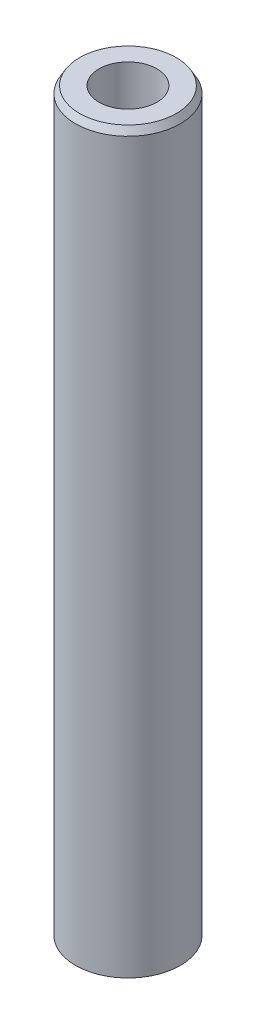
ISO-10303-21;
HEADER;
FILE_DESCRIPTION(('STEP AP214'),'2;1');
FILE_NAME('part.step','',(''),(''),'','','');
FILE_SCHEMA(('AUTOMOTIVE_DESIGN { 1 0 10303 214 1 1 1 1 }'));
ENDSEC;
DATA;
#1=APPLICATION_CONTEXT('core data for automotive mechanical design processes');
#2=APPLICATION_PROTOCOL_DEFINITION('international standard','automotive_design',2000,#1);
#3=PRODUCT_CONTEXT('',#1,'mechanical');
#4=PRODUCT('Part','Part','',(#3));
#5=PRODUCT_RELATED_PRODUCT_CATEGORY('part','',(#4));
#6=PRODUCT_DEFINITION_FORMATION('','',#4);
#7=PRODUCT_DEFINITION_CONTEXT('part definition',#1,'design');
#8=PRODUCT_DEFINITION('design','',#6,#7);
#9=PRODUCT_DEFINITION_SHAPE('','',#8);
#10=(LENGTH_UNIT() NAMED_UNIT(*) SI_UNIT(.MILLI.,.METRE.));
#11=(NAMED_UNIT(*) PLANE_ANGLE_UNIT() SI_UNIT($,.RADIAN.));
#12=(NAMED_UNIT(*) SI_UNIT($,.STERADIAN.) SOLID_ANGLE_UNIT());
#13=UNCERTAINTY_MEASURE_WITH_UNIT(LENGTH_MEASURE(1.E-05),#10,'distance_accuracy_value','');
#14=(GEOMETRIC_REPRESENTATION_CONTEXT(3) GLOBAL_UNCERTAINTY_ASSIGNED_CONTEXT((#13)) GLOBAL_UNIT_ASSIGNED_CONTEXT((#10,
#11,#12)) REPRESENTATION_CONTEXT('',''));
#15=CARTESIAN_POINT('',(0.,0.,0.));
#16=DIRECTION('',(0.,0.,1.));
#17=DIRECTION('',(1.,0.,0.));
#18=AXIS2_PLACEMENT_3D('',#15,#16,#17);
#19=CARTESIAN_POINT('',(0.,600.,0.));
#20=DIRECTION('',(0.,-1.,0.));
#21=DIRECTION('',(0.,0.,-1.));
#22=AXIS2_PLACEMENT_3D('',#19,#20,#21);
#23=CYLINDRICAL_SURFACE('',#22,42.5);
#24=CARTESIAN_POINT('',(0.,594.377826084345,0.));
#25=DIRECTION('',(0.,1.,0.));
#26=DIRECTION('',(0.,0.,1.));
#27=AXIS2_PLACEMENT_3D('',#24,#25,#26);
#28=CIRCLE('',#27,42.5);
#29=CARTESIAN_POINT('',(0.,594.377826084345,42.5));
#30=VERTEX_POINT('',#29);
#31=EDGE_CURVE('E50',#30,#30,#28,.F.);
#32=ORIENTED_EDGE('',*,*,#31,.T.);
#33=EDGE_LOOP('',(#32));
#34=FACE_BOUND('',#33,.T.);
#35=CARTESIAN_POINT('',(0.,3.24596362363394,0.));
#36=DIRECTION('',(0.,1.,0.));
#37=DIRECTION('',(0.,0.,1.));
#38=AXIS2_PLACEMENT_3D('',#35,#36,#37);
#39=CIRCLE('',#38,42.5);
#40=CARTESIAN_POINT('',(0.,3.24596362363394,42.5));
#41=VERTEX_POINT('',#40);
#42=EDGE_CURVE('E51',#41,#41,#39,.T.);
#43=ORIENTED_EDGE('',*,*,#42,.T.);
#44=EDGE_LOOP('',(#43));
#45=FACE_BOUND('',#44,.T.);
#46=ADVANCED_FACE('F39',(#34,#45),#23,.T.);
#47=CARTESIAN_POINT('',(0.,600.,0.));
#48=DIRECTION('',(0.,1.,0.));
#49=DIRECTION('',(0.,0.,1.));
#50=AXIS2_PLACEMENT_3D('',#47,#48,#49);
#51=PLANE('',#50);
#52=CARTESIAN_POINT('',(0.,600.,0.));
#53=DIRECTION('',(0.,1.,0.));
#54=DIRECTION('',(0.,0.,1.));
#55=AXIS2_PLACEMENT_3D('',#52,#53,#54);
#56=CIRCLE('',#55,39.2540363763659);
#57=CARTESIAN_POINT('',(0.,600.,39.2540363763659));
#58=VERTEX_POINT('',#57);
#59=EDGE_CURVE('E54',#58,#58,#56,.T.);
#60=ORIENTED_EDGE('',*,*,#59,.T.);
#61=EDGE_LOOP('',(#60));
#62=FACE_BOUND('',#61,.T.);
#63=CARTESIAN_POINT('',(0.,600.,0.));
#64=DIRECTION('',(0.,1.,0.));
#65=DIRECTION('',(0.,0.,1.));
#66=AXIS2_PLACEMENT_3D('',#63,#64,#65);
#67=CIRCLE('',#66,23.5028014830653);
#68=CARTESIAN_POINT('',(0.,600.,23.5028014830653));
#69=VERTEX_POINT('',#68);
#70=EDGE_CURVE('E58',#69,#69,#67,.T.);
#71=ORIENTED_EDGE('',*,*,#70,.F.);
#72=EDGE_LOOP('',(#71));
#73=FACE_BOUND('',#72,.T.);
#74=ADVANCED_FACE('F69',(#62,#73),#51,.T.);
#75=CARTESIAN_POINT('',(0.,0.,0.));
#76=DIRECTION('',(0.,1.,0.));
#77=DIRECTION('',(0.,0.,1.));
#78=AXIS2_PLACEMENT_3D('',#75,#76,#77);
#79=PLANE('',#78);
#80=CARTESIAN_POINT('',(0.,0.,0.));
#81=DIRECTION('',(0.,1.,0.));
#82=DIRECTION('',(0.,0.,1.));
#83=AXIS2_PLACEMENT_3D('',#80,#81,#82);
#84=CIRCLE('',#83,36.8778260843456);
#85=CARTESIAN_POINT('',(0.,0.,36.8778260843456));
#86=VERTEX_POINT('',#85);
#87=EDGE_CURVE('E10',#86,#86,#84,.F.);
#88=ORIENTED_EDGE('',*,*,#87,.T.);
#89=EDGE_LOOP('',(#88));
#90=FACE_BOUND('',#89,.T.);
#91=CARTESIAN_POINT('',(0.,0.,0.));
#92=DIRECTION('',(0.,1.,0.));
#93=DIRECTION('',(0.,0.,1.));
#94=AXIS2_PLACEMENT_3D('',#91,#92,#93);
#95=CIRCLE('',#94,23.5028014830653);
#96=CARTESIAN_POINT('',(0.,0.,23.5028014830653));
#97=VERTEX_POINT('',#96);
#98=EDGE_CURVE('E63',#97,#97,#95,.T.);
#99=ORIENTED_EDGE('',*,*,#98,.T.);
#100=EDGE_LOOP('',(#99));
#101=FACE_BOUND('',#100,.T.);
#102=ADVANCED_FACE('F75',(#90,#101),#79,.F.);
#103=CARTESIAN_POINT('',(0.,600.,0.));
#104=DIRECTION('',(0.,-1.,0.));
#105=DIRECTION('',(0.,0.,-1.));
#106=AXIS2_PLACEMENT_3D('',#103,#104,#105);
#107=CYLINDRICAL_SURFACE('',#106,23.5028014830653);
#108=ORIENTED_EDGE('',*,*,#70,.T.);
#109=EDGE_LOOP('',(#108));
#110=FACE_BOUND('',#109,.T.);
#111=ORIENTED_EDGE('',*,*,#98,.F.);
#112=EDGE_LOOP('',(#111));
#113=FACE_BOUND('',#112,.T.);
#114=ADVANCED_FACE('F70',(#110,#113),#107,.F.);
#115=CARTESIAN_POINT('',(0.,600.,0.));
#116=DIRECTION('',(0.,-1.,0.));
#117=DIRECTION('',(0.,0.,-1.));
#118=AXIS2_PLACEMENT_3D('',#115,#116,#117);
#119=CONICAL_SURFACE('',#118,39.2540363763659,0.523598775598294);
#120=ORIENTED_EDGE('',*,*,#31,.F.);
#121=EDGE_LOOP('',(#120));
#122=FACE_BOUND('',#121,.T.);
#123=ORIENTED_EDGE('',*,*,#59,.F.);
#124=EDGE_LOOP('',(#123));
#125=FACE_BOUND('',#124,.T.);
#126=ADVANCED_FACE('F81',(#122,#125),#119,.T.);
#127=CARTESIAN_POINT('',(0.,3.24596362363394,0.));
#128=DIRECTION('',(0.,1.,0.));
#129=DIRECTION('',(0.,0.,1.));
#130=AXIS2_PLACEMENT_3D('',#127,#128,#129);
#131=CONICAL_SURFACE('',#130,42.5,1.0471975511966);
#132=ORIENTED_EDGE('',*,*,#87,.F.);
#133=EDGE_LOOP('',(#132));
#134=FACE_BOUND('',#133,.T.);
#135=ORIENTED_EDGE('',*,*,#42,.F.);
#136=EDGE_LOOP('',(#135));
#137=FACE_BOUND('',#136,.T.);
#138=ADVANCED_FACE('F45',(#134,#137),#131,.T.);
#139=CLOSED_SHELL('',(#46,#74,#102,#114,#126,#138));
#140=MANIFOLD_SOLID_BREP('B2',#139);
#141=ADVANCED_BREP_SHAPE_REPRESENTATION('',(#18,#140),#14);
#142=SHAPE_DEFINITION_REPRESENTATION(#9,#141);
ENDSEC;
END-ISO-10303-21;
